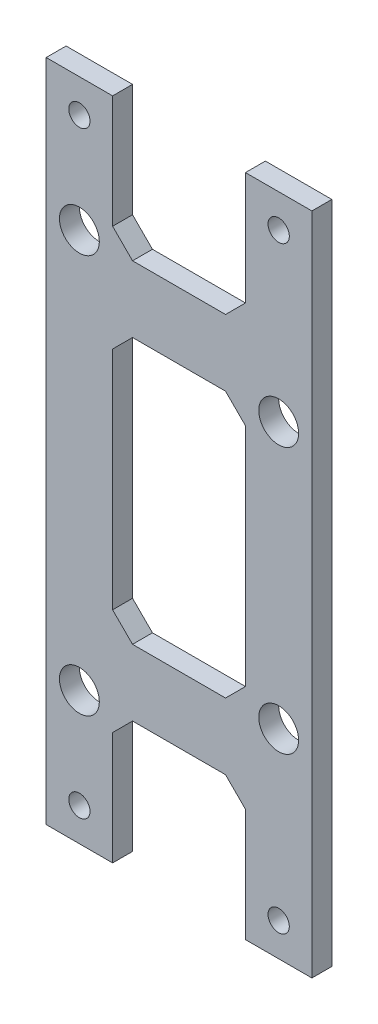
ISO-10303-21;
HEADER;
FILE_DESCRIPTION(('STEP AP214'),'2;1');
FILE_NAME('part.step','',(''),(''),'','','');
FILE_SCHEMA(('AUTOMOTIVE_DESIGN { 1 0 10303 214 1 1 1 1 }'));
ENDSEC;
DATA;
#1=APPLICATION_CONTEXT('core data for automotive mechanical design processes');
#2=APPLICATION_PROTOCOL_DEFINITION('international standard','automotive_design',2000,#1);
#3=PRODUCT_CONTEXT('',#1,'mechanical');
#4=PRODUCT('Part','Part','',(#3));
#5=PRODUCT_RELATED_PRODUCT_CATEGORY('part','',(#4));
#6=PRODUCT_DEFINITION_FORMATION('','',#4);
#7=PRODUCT_DEFINITION_CONTEXT('part definition',#1,'design');
#8=PRODUCT_DEFINITION('design','',#6,#7);
#9=PRODUCT_DEFINITION_SHAPE('','',#8);
#10=(LENGTH_UNIT() NAMED_UNIT(*) SI_UNIT(.MILLI.,.METRE.));
#11=(NAMED_UNIT(*) PLANE_ANGLE_UNIT() SI_UNIT($,.RADIAN.));
#12=(NAMED_UNIT(*) SI_UNIT($,.STERADIAN.) SOLID_ANGLE_UNIT());
#13=UNCERTAINTY_MEASURE_WITH_UNIT(LENGTH_MEASURE(1.E-05),#10,'distance_accuracy_value','');
#14=(GEOMETRIC_REPRESENTATION_CONTEXT(3) GLOBAL_UNCERTAINTY_ASSIGNED_CONTEXT((#13)) GLOBAL_UNIT_ASSIGNED_CONTEXT((#10,
#11,#12)) REPRESENTATION_CONTEXT('',''));
#15=CARTESIAN_POINT('',(0.,0.,0.));
#16=DIRECTION('',(0.,0.,1.));
#17=DIRECTION('',(1.,0.,0.));
#18=AXIS2_PLACEMENT_3D('',#15,#16,#17);
#19=CARTESIAN_POINT('',(0.,0.,3.));
#20=DIRECTION('',(0.,1.,0.));
#21=DIRECTION('',(0.,0.,1.));
#22=AXIS2_PLACEMENT_3D('',#19,#20,#21);
#23=PLANE('',#22);
#24=DIRECTION('',(1.,0.,0.));
#25=VECTOR('',#24,1.);
#26=CARTESIAN_POINT('',(0.,0.,0.));
#27=LINE('',#26,#25);
#28=CARTESIAN_POINT('',(0.,0.,0.));
#29=VERTEX_POINT('',#28);
#30=CARTESIAN_POINT('',(10.,0.,0.));
#31=VERTEX_POINT('',#30);
#32=EDGE_CURVE('E380',#29,#31,#27,.T.);
#33=ORIENTED_EDGE('',*,*,#32,.T.);
#34=DIRECTION('',(0.,0.,1.));
#35=VECTOR('',#34,1.);
#36=CARTESIAN_POINT('',(10.,0.,0.));
#37=LINE('',#36,#35);
#38=CARTESIAN_POINT('',(10.,0.,3.));
#39=VERTEX_POINT('',#38);
#40=EDGE_CURVE('E410',#31,#39,#37,.T.);
#41=ORIENTED_EDGE('',*,*,#40,.T.);
#42=DIRECTION('',(1.,0.,0.));
#43=VECTOR('',#42,1.);
#44=CARTESIAN_POINT('',(0.,0.,3.));
#45=LINE('',#44,#43);
#46=CARTESIAN_POINT('',(0.,0.,3.));
#47=VERTEX_POINT('',#46);
#48=EDGE_CURVE('E367',#47,#39,#45,.T.);
#49=ORIENTED_EDGE('',*,*,#48,.F.);
#50=DIRECTION('',(0.,0.,-1.));
#51=VECTOR('',#50,1.);
#52=CARTESIAN_POINT('',(0.,0.,3.));
#53=LINE('',#52,#51);
#54=EDGE_CURVE('E237',#47,#29,#53,.T.);
#55=ORIENTED_EDGE('',*,*,#54,.T.);
#56=EDGE_LOOP('',(#33,#41,#49,#55));
#57=FACE_BOUND('',#56,.T.);
#58=ADVANCED_FACE('F35',(#57),#23,.F.);
#59=CARTESIAN_POINT('',(0.,100.,3.));
#60=DIRECTION('',(0.,-1.,0.));
#61=DIRECTION('',(1.,0.,0.));
#62=AXIS2_PLACEMENT_3D('',#59,#60,#61);
#63=PLANE('',#62);
#64=DIRECTION('',(-1.,0.,0.));
#65=VECTOR('',#64,1.);
#66=CARTESIAN_POINT('',(0.,100.,3.));
#67=LINE('',#66,#65);
#68=CARTESIAN_POINT('',(10.,100.,3.));
#69=VERTEX_POINT('',#68);
#70=CARTESIAN_POINT('',(0.,100.,3.));
#71=VERTEX_POINT('',#70);
#72=EDGE_CURVE('E374',#69,#71,#67,.T.);
#73=ORIENTED_EDGE('',*,*,#72,.F.);
#74=DIRECTION('',(0.,0.,1.));
#75=VECTOR('',#74,1.);
#76=CARTESIAN_POINT('',(10.,100.,0.));
#77=LINE('',#76,#75);
#78=CARTESIAN_POINT('',(10.,100.,0.));
#79=VERTEX_POINT('',#78);
#80=EDGE_CURVE('E213',#79,#69,#77,.T.);
#81=ORIENTED_EDGE('',*,*,#80,.F.);
#82=DIRECTION('',(-1.,0.,0.));
#83=VECTOR('',#82,1.);
#84=CARTESIAN_POINT('',(0.,100.,0.));
#85=LINE('',#84,#83);
#86=CARTESIAN_POINT('',(0.,100.,0.));
#87=VERTEX_POINT('',#86);
#88=EDGE_CURVE('E220',#79,#87,#85,.T.);
#89=ORIENTED_EDGE('',*,*,#88,.T.);
#90=DIRECTION('',(0.,0.,-1.));
#91=VECTOR('',#90,1.);
#92=CARTESIAN_POINT('',(0.,100.,3.));
#93=LINE('',#92,#91);
#94=EDGE_CURVE('E229',#71,#87,#93,.T.);
#95=ORIENTED_EDGE('',*,*,#94,.F.);
#96=EDGE_LOOP('',(#73,#81,#89,#95));
#97=FACE_BOUND('',#96,.T.);
#98=ADVANCED_FACE('F338',(#97),#63,.F.);
#99=CARTESIAN_POINT('',(0.,0.,3.));
#100=DIRECTION('',(0.,0.,-1.));
#101=DIRECTION('',(-1.,0.,0.));
#102=AXIS2_PLACEMENT_3D('',#99,#100,#101);
#103=PLANE('',#102);
#104=DIRECTION('',(-1.,0.,0.));
#105=VECTOR('',#104,1.);
#106=CARTESIAN_POINT('',(30.,70.,3.));
#107=LINE('',#106,#105);
#108=CARTESIAN_POINT('',(27.,70.,3.));
#109=VERTEX_POINT('',#108);
#110=CARTESIAN_POINT('',(13.,70.,3.));
#111=VERTEX_POINT('',#110);
#112=EDGE_CURVE('E497',#109,#111,#107,.T.);
#113=ORIENTED_EDGE('',*,*,#112,.F.);
#114=DIRECTION('',(-0.707106781186551,0.707106781186544,0.));
#115=VECTOR('',#114,1.);
#116=CARTESIAN_POINT('',(48.4999999999999,48.5000000000003,3.));
#117=LINE('',#116,#115);
#118=CARTESIAN_POINT('',(30.,67.,3.));
#119=VERTEX_POINT('',#118);
#120=EDGE_CURVE('E291',#109,#119,#117,.F.);
#121=ORIENTED_EDGE('',*,*,#120,.T.);
#122=DIRECTION('',(0.,1.,0.));
#123=VECTOR('',#122,1.);
#124=CARTESIAN_POINT('',(30.,30.,3.));
#125=LINE('',#124,#123);
#126=CARTESIAN_POINT('',(30.,33.,3.));
#127=VERTEX_POINT('',#126);
#128=EDGE_CURVE('E503',#127,#119,#125,.T.);
#129=ORIENTED_EDGE('',*,*,#128,.F.);
#130=DIRECTION('',(0.707106781186544,0.707106781186551,0.));
#131=VECTOR('',#130,1.);
#132=CARTESIAN_POINT('',(-1.49999999999988,1.49999999999986,3.));
#133=LINE('',#132,#131);
#134=CARTESIAN_POINT('',(27.,30.,3.));
#135=VERTEX_POINT('',#134);
#136=EDGE_CURVE('E303',#127,#135,#133,.F.);
#137=ORIENTED_EDGE('',*,*,#136,.T.);
#138=DIRECTION('',(1.,0.,0.));
#139=VECTOR('',#138,1.);
#140=CARTESIAN_POINT('',(30.,30.,3.));
#141=LINE('',#140,#139);
#142=CARTESIAN_POINT('',(13.,30.,3.));
#143=VERTEX_POINT('',#142);
#144=EDGE_CURVE('E506',#143,#135,#141,.T.);
#145=ORIENTED_EDGE('',*,*,#144,.F.);
#146=DIRECTION('',(0.70710678118655,-0.707106781186545,0.));
#147=VECTOR('',#146,1.);
#148=CARTESIAN_POINT('',(21.5,21.5000000000001,3.));
#149=LINE('',#148,#147);
#150=CARTESIAN_POINT('',(10.,33.,3.));
#151=VERTEX_POINT('',#150);
#152=EDGE_CURVE('E299',#143,#151,#149,.F.);
#153=ORIENTED_EDGE('',*,*,#152,.T.);
#154=DIRECTION('',(0.,-1.,0.));
#155=VECTOR('',#154,1.);
#156=CARTESIAN_POINT('',(10.,30.,3.));
#157=LINE('',#156,#155);
#158=CARTESIAN_POINT('',(10.,67.,3.));
#159=VERTEX_POINT('',#158);
#160=EDGE_CURVE('E502',#159,#151,#157,.T.);
#161=ORIENTED_EDGE('',*,*,#160,.F.);
#162=DIRECTION('',(-0.707106781186543,-0.707106781186552,0.));
#163=VECTOR('',#162,1.);
#164=CARTESIAN_POINT('',(-28.4999999999999,28.4999999999995,3.));
#165=LINE('',#164,#163);
#166=EDGE_CURVE('E295',#159,#111,#165,.F.);
#167=ORIENTED_EDGE('',*,*,#166,.T.);
#168=EDGE_LOOP('',(#113,#121,#129,#137,#145,#153,#161,#167));
#169=FACE_BOUND('',#168,.T.);
#170=DIRECTION('',(1.,0.,0.));
#171=VECTOR('',#170,1.);
#172=CARTESIAN_POINT('',(10.,80.,3.));
#173=LINE('',#172,#171);
#174=CARTESIAN_POINT('',(13.,80.,3.));
#175=VERTEX_POINT('',#174);
#176=CARTESIAN_POINT('',(27.,80.,3.));
#177=VERTEX_POINT('',#176);
#178=EDGE_CURVE('E323',#175,#177,#173,.T.);
#179=ORIENTED_EDGE('',*,*,#178,.F.);
#180=DIRECTION('',(0.707106781186551,-0.707106781186544,0.));
#181=VECTOR('',#180,1.);
#182=CARTESIAN_POINT('',(46.5,46.5000000000004,3.));
#183=LINE('',#182,#181);
#184=CARTESIAN_POINT('',(10.,83.,3.));
#185=VERTEX_POINT('',#184);
#186=EDGE_CURVE('E315',#175,#185,#183,.F.);
#187=ORIENTED_EDGE('',*,*,#186,.T.);
#188=DIRECTION('',(0.,-1.,0.));
#189=VECTOR('',#188,1.);
#190=CARTESIAN_POINT('',(10.,100.,3.));
#191=LINE('',#190,#189);
#192=EDGE_CURVE('E328',#69,#185,#191,.T.);
#193=ORIENTED_EDGE('',*,*,#192,.F.);
#194=ORIENTED_EDGE('',*,*,#72,.T.);
#195=DIRECTION('',(0.,-1.,0.));
#196=VECTOR('',#195,1.);
#197=CARTESIAN_POINT('',(0.,0.,3.));
#198=LINE('',#197,#196);
#199=EDGE_CURVE('E219',#71,#47,#198,.T.);
#200=ORIENTED_EDGE('',*,*,#199,.T.);
#201=ORIENTED_EDGE('',*,*,#48,.T.);
#202=DIRECTION('',(0.,-1.,0.));
#203=VECTOR('',#202,1.);
#204=CARTESIAN_POINT('',(10.,20.,3.));
#205=LINE('',#204,#203);
#206=CARTESIAN_POINT('',(10.,17.,3.));
#207=VERTEX_POINT('',#206);
#208=EDGE_CURVE('E405',#207,#39,#205,.T.);
#209=ORIENTED_EDGE('',*,*,#208,.F.);
#210=DIRECTION('',(-0.707106781186544,-0.707106781186551,0.));
#211=VECTOR('',#210,1.);
#212=CARTESIAN_POINT('',(-3.49999999999994,3.49999999999991,3.));
#213=LINE('',#212,#211);
#214=CARTESIAN_POINT('',(13.,20.,3.));
#215=VERTEX_POINT('',#214);
#216=EDGE_CURVE('E307',#207,#215,#213,.F.);
#217=ORIENTED_EDGE('',*,*,#216,.T.);
#218=DIRECTION('',(-1.,0.,0.));
#219=VECTOR('',#218,1.);
#220=CARTESIAN_POINT('',(10.,20.,3.));
#221=LINE('',#220,#219);
#222=CARTESIAN_POINT('',(27.,20.,3.));
#223=VERTEX_POINT('',#222);
#224=EDGE_CURVE('E398',#223,#215,#221,.T.);
#225=ORIENTED_EDGE('',*,*,#224,.F.);
#226=DIRECTION('',(-0.70710678118655,0.707106781186545,0.));
#227=VECTOR('',#226,1.);
#228=CARTESIAN_POINT('',(23.4999999999999,23.5000000000001,3.));
#229=LINE('',#228,#227);
#230=CARTESIAN_POINT('',(30.,17.,3.));
#231=VERTEX_POINT('',#230);
#232=EDGE_CURVE('E311',#223,#231,#229,.F.);
#233=ORIENTED_EDGE('',*,*,#232,.T.);
#234=DIRECTION('',(0.,1.,0.));
#235=VECTOR('',#234,1.);
#236=CARTESIAN_POINT('',(30.,20.,3.));
#237=LINE('',#236,#235);
#238=CARTESIAN_POINT('',(30.,0.,3.));
#239=VERTEX_POINT('',#238);
#240=EDGE_CURVE('E402',#239,#231,#237,.T.);
#241=ORIENTED_EDGE('',*,*,#240,.F.);
#242=CARTESIAN_POINT('',(40.,0.,3.));
#243=VERTEX_POINT('',#242);
#244=EDGE_CURVE('E223',#239,#243,#45,.T.);
#245=ORIENTED_EDGE('',*,*,#244,.T.);
#246=DIRECTION('',(0.,1.,0.));
#247=VECTOR('',#246,1.);
#248=CARTESIAN_POINT('',(40.,0.,3.));
#249=LINE('',#248,#247);
#250=CARTESIAN_POINT('',(40.,100.,3.));
#251=VERTEX_POINT('',#250);
#252=EDGE_CURVE('E370',#243,#251,#249,.T.);
#253=ORIENTED_EDGE('',*,*,#252,.T.);
#254=CARTESIAN_POINT('',(30.,100.,3.));
#255=VERTEX_POINT('',#254);
#256=EDGE_CURVE('E232',#251,#255,#67,.T.);
#257=ORIENTED_EDGE('',*,*,#256,.T.);
#258=DIRECTION('',(0.,1.,0.));
#259=VECTOR('',#258,1.);
#260=CARTESIAN_POINT('',(30.,100.,3.));
#261=LINE('',#260,#259);
#262=CARTESIAN_POINT('',(30.,83.,3.));
#263=VERTEX_POINT('',#262);
#264=EDGE_CURVE('E209',#263,#255,#261,.T.);
#265=ORIENTED_EDGE('',*,*,#264,.F.);
#266=DIRECTION('',(0.707106781186543,0.707106781186552,0.));
#267=VECTOR('',#266,1.);
#268=CARTESIAN_POINT('',(-26.4999999999998,26.4999999999994,3.));
#269=LINE('',#268,#267);
#270=EDGE_CURVE('E44',#263,#177,#269,.F.);
#271=ORIENTED_EDGE('',*,*,#270,.T.);
#272=EDGE_LOOP('',(#179,#187,#193,#194,#200,#201,#209,#217,#225,#233,#241,#245,#253,#257,#265,#271));
#273=FACE_BOUND('',#272,.T.);
#274=CARTESIAN_POINT('',(5.,95.,3.));
#275=DIRECTION('',(0.,0.,1.));
#276=DIRECTION('',(1.,0.,0.));
#277=AXIS2_PLACEMENT_3D('',#274,#275,#276);
#278=CIRCLE('',#277,1.60000000000002);
#279=CARTESIAN_POINT('',(6.60000000000002,95.,3.));
#280=VERTEX_POINT('',#279);
#281=EDGE_CURVE('E379',#280,#280,#278,.T.);
#282=ORIENTED_EDGE('',*,*,#281,.F.);
#283=EDGE_LOOP('',(#282));
#284=FACE_BOUND('',#283,.T.);
#285=CARTESIAN_POINT('',(35.,95.,3.));
#286=DIRECTION('',(0.,0.,1.));
#287=DIRECTION('',(1.,0.,0.));
#288=AXIS2_PLACEMENT_3D('',#285,#286,#287);
#289=CIRCLE('',#288,1.60000000000001);
#290=CARTESIAN_POINT('',(36.6,95.,3.));
#291=VERTEX_POINT('',#290);
#292=EDGE_CURVE('E449',#291,#291,#289,.T.);
#293=ORIENTED_EDGE('',*,*,#292,.F.);
#294=EDGE_LOOP('',(#293));
#295=FACE_BOUND('',#294,.T.);
#296=CARTESIAN_POINT('',(5.,80.,3.));
#297=DIRECTION('',(0.,0.,1.));
#298=DIRECTION('',(1.,0.,0.));
#299=AXIS2_PLACEMENT_3D('',#296,#297,#298);
#300=CIRCLE('',#299,3.);
#301=CARTESIAN_POINT('',(8.,80.,3.));
#302=VERTEX_POINT('',#301);
#303=EDGE_CURVE('E443',#302,#302,#300,.T.);
#304=ORIENTED_EDGE('',*,*,#303,.F.);
#305=EDGE_LOOP('',(#304));
#306=FACE_BOUND('',#305,.T.);
#307=CARTESIAN_POINT('',(35.,70.,3.));
#308=DIRECTION('',(0.,0.,1.));
#309=DIRECTION('',(1.,0.,0.));
#310=AXIS2_PLACEMENT_3D('',#307,#308,#309);
#311=CIRCLE('',#310,3.);
#312=CARTESIAN_POINT('',(38.,70.,3.));
#313=VERTEX_POINT('',#312);
#314=EDGE_CURVE('E437',#313,#313,#311,.T.);
#315=ORIENTED_EDGE('',*,*,#314,.F.);
#316=EDGE_LOOP('',(#315));
#317=FACE_BOUND('',#316,.T.);
#318=CARTESIAN_POINT('',(5.,20.,3.));
#319=DIRECTION('',(0.,0.,1.));
#320=DIRECTION('',(1.,0.,0.));
#321=AXIS2_PLACEMENT_3D('',#318,#319,#320);
#322=CIRCLE('',#321,3.);
#323=CARTESIAN_POINT('',(8.,20.,3.));
#324=VERTEX_POINT('',#323);
#325=EDGE_CURVE('E431',#324,#324,#322,.T.);
#326=ORIENTED_EDGE('',*,*,#325,.F.);
#327=EDGE_LOOP('',(#326));
#328=FACE_BOUND('',#327,.T.);
#329=CARTESIAN_POINT('',(35.,30.,3.));
#330=DIRECTION('',(0.,0.,1.));
#331=DIRECTION('',(1.,0.,0.));
#332=AXIS2_PLACEMENT_3D('',#329,#330,#331);
#333=CIRCLE('',#332,3.);
#334=CARTESIAN_POINT('',(38.,30.,3.));
#335=VERTEX_POINT('',#334);
#336=EDGE_CURVE('E425',#335,#335,#333,.T.);
#337=ORIENTED_EDGE('',*,*,#336,.F.);
#338=EDGE_LOOP('',(#337));
#339=FACE_BOUND('',#338,.T.);
#340=CARTESIAN_POINT('',(5.,5.,3.));
#341=DIRECTION('',(0.,0.,1.));
#342=DIRECTION('',(1.,0.,0.));
#343=AXIS2_PLACEMENT_3D('',#340,#341,#342);
#344=CIRCLE('',#343,1.6);
#345=CARTESIAN_POINT('',(6.6,5.,3.));
#346=VERTEX_POINT('',#345);
#347=EDGE_CURVE('E419',#346,#346,#344,.T.);
#348=ORIENTED_EDGE('',*,*,#347,.F.);
#349=EDGE_LOOP('',(#348));
#350=FACE_BOUND('',#349,.T.);
#351=CARTESIAN_POINT('',(35.,5.,3.));
#352=DIRECTION('',(0.,0.,1.));
#353=DIRECTION('',(1.,0.,0.));
#354=AXIS2_PLACEMENT_3D('',#351,#352,#353);
#355=CIRCLE('',#354,1.6);
#356=CARTESIAN_POINT('',(36.6,5.,3.));
#357=VERTEX_POINT('',#356);
#358=EDGE_CURVE('E412',#357,#357,#355,.T.);
#359=ORIENTED_EDGE('',*,*,#358,.F.);
#360=EDGE_LOOP('',(#359));
#361=FACE_BOUND('',#360,.T.);
#362=ADVANCED_FACE('F321',(#169,#273,#284,#295,#306,#317,#328,#339,#350,#361),#103,.F.);
#363=CARTESIAN_POINT('',(0.,0.,0.));
#364=DIRECTION('',(0.,0.,-1.));
#365=DIRECTION('',(-1.,0.,0.));
#366=AXIS2_PLACEMENT_3D('',#363,#364,#365);
#367=PLANE('',#366);
#368=DIRECTION('',(0.,-1.,0.));
#369=VECTOR('',#368,1.);
#370=CARTESIAN_POINT('',(30.,0.,0.));
#371=LINE('',#370,#369);
#372=CARTESIAN_POINT('',(30.,67.,0.));
#373=VERTEX_POINT('',#372);
#374=CARTESIAN_POINT('',(30.,33.,0.));
#375=VERTEX_POINT('',#374);
#376=EDGE_CURVE('E249',#373,#375,#371,.T.);
#377=ORIENTED_EDGE('',*,*,#376,.F.);
#378=DIRECTION('',(0.707106781186551,-0.707106781186544,0.));
#379=VECTOR('',#378,1.);
#380=CARTESIAN_POINT('',(27.,70.,0.));
#381=LINE('',#380,#379);
#382=CARTESIAN_POINT('',(27.,70.,0.));
#383=VERTEX_POINT('',#382);
#384=EDGE_CURVE('E293',#373,#383,#381,.F.);
#385=ORIENTED_EDGE('',*,*,#384,.T.);
#386=DIRECTION('',(1.,0.,0.));
#387=VECTOR('',#386,1.);
#388=CARTESIAN_POINT('',(0.,70.,0.));
#389=LINE('',#388,#387);
#390=CARTESIAN_POINT('',(13.,70.,0.));
#391=VERTEX_POINT('',#390);
#392=EDGE_CURVE('E240',#391,#383,#389,.T.);
#393=ORIENTED_EDGE('',*,*,#392,.F.);
#394=DIRECTION('',(0.707106781186543,0.707106781186552,0.));
#395=VECTOR('',#394,1.);
#396=CARTESIAN_POINT('',(10.,67.,0.));
#397=LINE('',#396,#395);
#398=CARTESIAN_POINT('',(10.,67.,0.));
#399=VERTEX_POINT('',#398);
#400=EDGE_CURVE('E297',#391,#399,#397,.F.);
#401=ORIENTED_EDGE('',*,*,#400,.T.);
#402=DIRECTION('',(0.,1.,0.));
#403=VECTOR('',#402,1.);
#404=CARTESIAN_POINT('',(10.,0.,0.));
#405=LINE('',#404,#403);
#406=CARTESIAN_POINT('',(10.,33.,0.));
#407=VERTEX_POINT('',#406);
#408=EDGE_CURVE('E243',#407,#399,#405,.T.);
#409=ORIENTED_EDGE('',*,*,#408,.F.);
#410=DIRECTION('',(-0.70710678118655,0.707106781186545,0.));
#411=VECTOR('',#410,1.);
#412=CARTESIAN_POINT('',(13.,30.,0.));
#413=LINE('',#412,#411);
#414=CARTESIAN_POINT('',(13.,30.,0.));
#415=VERTEX_POINT('',#414);
#416=EDGE_CURVE('E301',#407,#415,#413,.F.);
#417=ORIENTED_EDGE('',*,*,#416,.T.);
#418=DIRECTION('',(-1.,0.,0.));
#419=VECTOR('',#418,1.);
#420=CARTESIAN_POINT('',(0.,30.,0.));
#421=LINE('',#420,#419);
#422=CARTESIAN_POINT('',(27.,30.,0.));
#423=VERTEX_POINT('',#422);
#424=EDGE_CURVE('E246',#423,#415,#421,.T.);
#425=ORIENTED_EDGE('',*,*,#424,.F.);
#426=DIRECTION('',(-0.707106781186544,-0.707106781186551,0.));
#427=VECTOR('',#426,1.);
#428=CARTESIAN_POINT('',(30.,33.,0.));
#429=LINE('',#428,#427);
#430=EDGE_CURVE('E305',#423,#375,#429,.F.);
#431=ORIENTED_EDGE('',*,*,#430,.T.);
#432=EDGE_LOOP('',(#377,#385,#393,#401,#409,#417,#425,#431));
#433=FACE_BOUND('',#432,.T.);
#434=DIRECTION('',(0.,-1.,0.));
#435=VECTOR('',#434,1.);
#436=CARTESIAN_POINT('',(10.,100.,0.));
#437=LINE('',#436,#435);
#438=CARTESIAN_POINT('',(10.,83.,0.));
#439=VERTEX_POINT('',#438);
#440=EDGE_CURVE('E512',#79,#439,#437,.T.);
#441=ORIENTED_EDGE('',*,*,#440,.T.);
#442=DIRECTION('',(-0.707106781186551,0.707106781186544,0.));
#443=VECTOR('',#442,1.);
#444=CARTESIAN_POINT('',(13.,80.,0.));
#445=LINE('',#444,#443);
#446=CARTESIAN_POINT('',(13.,80.,0.));
#447=VERTEX_POINT('',#446);
#448=EDGE_CURVE('E317',#439,#447,#445,.F.);
#449=ORIENTED_EDGE('',*,*,#448,.T.);
#450=DIRECTION('',(1.,0.,0.));
#451=VECTOR('',#450,1.);
#452=CARTESIAN_POINT('',(10.,80.,0.));
#453=LINE('',#452,#451);
#454=CARTESIAN_POINT('',(27.,80.,0.));
#455=VERTEX_POINT('',#454);
#456=EDGE_CURVE('E204',#447,#455,#453,.T.);
#457=ORIENTED_EDGE('',*,*,#456,.T.);
#458=DIRECTION('',(-0.707106781186543,-0.707106781186552,0.));
#459=VECTOR('',#458,1.);
#460=CARTESIAN_POINT('',(30.,83.,0.));
#461=LINE('',#460,#459);
#462=CARTESIAN_POINT('',(30.,83.,0.));
#463=VERTEX_POINT('',#462);
#464=EDGE_CURVE('E11',#455,#463,#461,.F.);
#465=ORIENTED_EDGE('',*,*,#464,.T.);
#466=DIRECTION('',(0.,1.,0.));
#467=VECTOR('',#466,1.);
#468=CARTESIAN_POINT('',(30.,100.,0.));
#469=LINE('',#468,#467);
#470=CARTESIAN_POINT('',(30.,100.,0.));
#471=VERTEX_POINT('',#470);
#472=EDGE_CURVE('E194',#463,#471,#469,.T.);
#473=ORIENTED_EDGE('',*,*,#472,.T.);
#474=CARTESIAN_POINT('',(40.,100.,0.));
#475=VERTEX_POINT('',#474);
#476=EDGE_CURVE('E201',#475,#471,#85,.T.);
#477=ORIENTED_EDGE('',*,*,#476,.F.);
#478=DIRECTION('',(0.,1.,0.));
#479=VECTOR('',#478,1.);
#480=CARTESIAN_POINT('',(40.,0.,0.));
#481=LINE('',#480,#479);
#482=CARTESIAN_POINT('',(40.,0.,0.));
#483=VERTEX_POINT('',#482);
#484=EDGE_CURVE('E225',#483,#475,#481,.T.);
#485=ORIENTED_EDGE('',*,*,#484,.F.);
#486=CARTESIAN_POINT('',(30.,0.,0.));
#487=VERTEX_POINT('',#486);
#488=EDGE_CURVE('E378',#487,#483,#27,.T.);
#489=ORIENTED_EDGE('',*,*,#488,.F.);
#490=DIRECTION('',(0.,1.,0.));
#491=VECTOR('',#490,1.);
#492=CARTESIAN_POINT('',(30.,20.,0.));
#493=LINE('',#492,#491);
#494=CARTESIAN_POINT('',(30.,17.,0.));
#495=VERTEX_POINT('',#494);
#496=EDGE_CURVE('E383',#487,#495,#493,.T.);
#497=ORIENTED_EDGE('',*,*,#496,.T.);
#498=DIRECTION('',(0.70710678118655,-0.707106781186545,0.));
#499=VECTOR('',#498,1.);
#500=CARTESIAN_POINT('',(27.,20.,0.));
#501=LINE('',#500,#499);
#502=CARTESIAN_POINT('',(27.,20.,0.));
#503=VERTEX_POINT('',#502);
#504=EDGE_CURVE('E313',#495,#503,#501,.F.);
#505=ORIENTED_EDGE('',*,*,#504,.T.);
#506=DIRECTION('',(-1.,0.,0.));
#507=VECTOR('',#506,1.);
#508=CARTESIAN_POINT('',(10.,20.,0.));
#509=LINE('',#508,#507);
#510=CARTESIAN_POINT('',(13.,20.,0.));
#511=VERTEX_POINT('',#510);
#512=EDGE_CURVE('E388',#503,#511,#509,.T.);
#513=ORIENTED_EDGE('',*,*,#512,.T.);
#514=DIRECTION('',(0.707106781186544,0.707106781186551,0.));
#515=VECTOR('',#514,1.);
#516=CARTESIAN_POINT('',(10.,17.,0.));
#517=LINE('',#516,#515);
#518=CARTESIAN_POINT('',(10.,17.,0.));
#519=VERTEX_POINT('',#518);
#520=EDGE_CURVE('E309',#511,#519,#517,.F.);
#521=ORIENTED_EDGE('',*,*,#520,.T.);
#522=DIRECTION('',(0.,-1.,0.));
#523=VECTOR('',#522,1.);
#524=CARTESIAN_POINT('',(10.,20.,0.));
#525=LINE('',#524,#523);
#526=EDGE_CURVE('E389',#519,#31,#525,.T.);
#527=ORIENTED_EDGE('',*,*,#526,.T.);
#528=ORIENTED_EDGE('',*,*,#32,.F.);
#529=DIRECTION('',(0.,-1.,0.));
#530=VECTOR('',#529,1.);
#531=CARTESIAN_POINT('',(0.,0.,0.));
#532=LINE('',#531,#530);
#533=EDGE_CURVE('E376',#87,#29,#532,.T.);
#534=ORIENTED_EDGE('',*,*,#533,.F.);
#535=ORIENTED_EDGE('',*,*,#88,.F.);
#536=EDGE_LOOP('',(#441,#449,#457,#465,#473,#477,#485,#489,#497,#505,#513,#521,#527,#528,#534,#535));
#537=FACE_BOUND('',#536,.T.);
#538=CARTESIAN_POINT('',(5.,5.,0.));
#539=DIRECTION('',(0.,0.,1.));
#540=DIRECTION('',(1.,0.,0.));
#541=AXIS2_PLACEMENT_3D('',#538,#539,#540);
#542=CIRCLE('',#541,1.6);
#543=CARTESIAN_POINT('',(6.6,5.,0.));
#544=VERTEX_POINT('',#543);
#545=EDGE_CURVE('E415',#544,#544,#542,.T.);
#546=ORIENTED_EDGE('',*,*,#545,.T.);
#547=EDGE_LOOP('',(#546));
#548=FACE_BOUND('',#547,.T.);
#549=CARTESIAN_POINT('',(5.,20.,0.));
#550=DIRECTION('',(0.,0.,1.));
#551=DIRECTION('',(1.,0.,0.));
#552=AXIS2_PLACEMENT_3D('',#549,#550,#551);
#553=CIRCLE('',#552,3.);
#554=CARTESIAN_POINT('',(8.,20.,0.));
#555=VERTEX_POINT('',#554);
#556=EDGE_CURVE('E428',#555,#555,#553,.T.);
#557=ORIENTED_EDGE('',*,*,#556,.T.);
#558=EDGE_LOOP('',(#557));
#559=FACE_BOUND('',#558,.T.);
#560=CARTESIAN_POINT('',(5.,80.,0.));
#561=DIRECTION('',(0.,0.,1.));
#562=DIRECTION('',(1.,0.,0.));
#563=AXIS2_PLACEMENT_3D('',#560,#561,#562);
#564=CIRCLE('',#563,3.);
#565=CARTESIAN_POINT('',(8.,80.,0.));
#566=VERTEX_POINT('',#565);
#567=EDGE_CURVE('E440',#566,#566,#564,.T.);
#568=ORIENTED_EDGE('',*,*,#567,.T.);
#569=EDGE_LOOP('',(#568));
#570=FACE_BOUND('',#569,.T.);
#571=CARTESIAN_POINT('',(5.,95.,0.));
#572=DIRECTION('',(0.,0.,1.));
#573=DIRECTION('',(1.,0.,0.));
#574=AXIS2_PLACEMENT_3D('',#571,#572,#573);
#575=CIRCLE('',#574,1.60000000000002);
#576=CARTESIAN_POINT('',(6.60000000000002,95.,0.));
#577=VERTEX_POINT('',#576);
#578=EDGE_CURVE('E452',#577,#577,#575,.T.);
#579=ORIENTED_EDGE('',*,*,#578,.T.);
#580=EDGE_LOOP('',(#579));
#581=FACE_BOUND('',#580,.T.);
#582=CARTESIAN_POINT('',(35.,95.,0.));
#583=DIRECTION('',(0.,0.,1.));
#584=DIRECTION('',(1.,0.,0.));
#585=AXIS2_PLACEMENT_3D('',#582,#583,#584);
#586=CIRCLE('',#585,1.60000000000001);
#587=CARTESIAN_POINT('',(36.6,95.,0.));
#588=VERTEX_POINT('',#587);
#589=EDGE_CURVE('E446',#588,#588,#586,.T.);
#590=ORIENTED_EDGE('',*,*,#589,.T.);
#591=EDGE_LOOP('',(#590));
#592=FACE_BOUND('',#591,.T.);
#593=CARTESIAN_POINT('',(35.,70.,0.));
#594=DIRECTION('',(0.,0.,1.));
#595=DIRECTION('',(1.,0.,0.));
#596=AXIS2_PLACEMENT_3D('',#593,#594,#595);
#597=CIRCLE('',#596,3.);
#598=CARTESIAN_POINT('',(38.,70.,0.));
#599=VERTEX_POINT('',#598);
#600=EDGE_CURVE('E434',#599,#599,#597,.T.);
#601=ORIENTED_EDGE('',*,*,#600,.T.);
#602=EDGE_LOOP('',(#601));
#603=FACE_BOUND('',#602,.T.);
#604=CARTESIAN_POINT('',(35.,30.,0.));
#605=DIRECTION('',(0.,0.,1.));
#606=DIRECTION('',(1.,0.,0.));
#607=AXIS2_PLACEMENT_3D('',#604,#605,#606);
#608=CIRCLE('',#607,3.);
#609=CARTESIAN_POINT('',(38.,30.,0.));
#610=VERTEX_POINT('',#609);
#611=EDGE_CURVE('E422',#610,#610,#608,.T.);
#612=ORIENTED_EDGE('',*,*,#611,.T.);
#613=EDGE_LOOP('',(#612));
#614=FACE_BOUND('',#613,.T.);
#615=CARTESIAN_POINT('',(35.,5.,0.));
#616=DIRECTION('',(0.,0.,1.));
#617=DIRECTION('',(1.,0.,0.));
#618=AXIS2_PLACEMENT_3D('',#615,#616,#617);
#619=CIRCLE('',#618,1.6);
#620=CARTESIAN_POINT('',(36.6,5.,0.));
#621=VERTEX_POINT('',#620);
#622=EDGE_CURVE('E416',#621,#621,#619,.T.);
#623=ORIENTED_EDGE('',*,*,#622,.T.);
#624=EDGE_LOOP('',(#623));
#625=FACE_BOUND('',#624,.T.);
#626=ADVANCED_FACE('F197',(#433,#537,#548,#559,#570,#581,#592,#603,#614,#625),#367,.T.);
#627=CARTESIAN_POINT('',(0.,0.,3.));
#628=DIRECTION('',(1.,0.,0.));
#629=DIRECTION('',(0.,0.,-1.));
#630=AXIS2_PLACEMENT_3D('',#627,#628,#629);
#631=PLANE('',#630);
#632=ORIENTED_EDGE('',*,*,#533,.T.);
#633=ORIENTED_EDGE('',*,*,#54,.F.);
#634=ORIENTED_EDGE('',*,*,#199,.F.);
#635=ORIENTED_EDGE('',*,*,#94,.T.);
#636=EDGE_LOOP('',(#632,#633,#634,#635));
#637=FACE_BOUND('',#636,.T.);
#638=ADVANCED_FACE('F352',(#637),#631,.F.);
#639=ORIENTED_EDGE('',*,*,#244,.F.);
#640=DIRECTION('',(0.,0.,1.));
#641=VECTOR('',#640,1.);
#642=CARTESIAN_POINT('',(30.,0.,0.));
#643=LINE('',#642,#641);
#644=EDGE_CURVE('E363',#487,#239,#643,.T.);
#645=ORIENTED_EDGE('',*,*,#644,.F.);
#646=ORIENTED_EDGE('',*,*,#488,.T.);
#647=DIRECTION('',(0.,0.,-1.));
#648=VECTOR('',#647,1.);
#649=CARTESIAN_POINT('',(40.,0.,3.));
#650=LINE('',#649,#648);
#651=EDGE_CURVE('E234',#243,#483,#650,.T.);
#652=ORIENTED_EDGE('',*,*,#651,.F.);
#653=EDGE_LOOP('',(#639,#645,#646,#652));
#654=FACE_BOUND('',#653,.T.);
#655=ADVANCED_FACE('F341',(#654),#23,.F.);
#656=CARTESIAN_POINT('',(40.,0.,3.));
#657=DIRECTION('',(-1.,0.,0.));
#658=DIRECTION('',(0.,0.,1.));
#659=AXIS2_PLACEMENT_3D('',#656,#657,#658);
#660=PLANE('',#659);
#661=ORIENTED_EDGE('',*,*,#484,.T.);
#662=DIRECTION('',(0.,0.,-1.));
#663=VECTOR('',#662,1.);
#664=CARTESIAN_POINT('',(40.,100.,3.));
#665=LINE('',#664,#663);
#666=EDGE_CURVE('E218',#251,#475,#665,.T.);
#667=ORIENTED_EDGE('',*,*,#666,.F.);
#668=ORIENTED_EDGE('',*,*,#252,.F.);
#669=ORIENTED_EDGE('',*,*,#651,.T.);
#670=EDGE_LOOP('',(#661,#667,#668,#669));
#671=FACE_BOUND('',#670,.T.);
#672=ADVANCED_FACE('F351',(#671),#660,.F.);
#673=ORIENTED_EDGE('',*,*,#476,.T.);
#674=DIRECTION('',(0.,0.,1.));
#675=VECTOR('',#674,1.);
#676=CARTESIAN_POINT('',(30.,100.,0.));
#677=LINE('',#676,#675);
#678=EDGE_CURVE('E203',#471,#255,#677,.T.);
#679=ORIENTED_EDGE('',*,*,#678,.T.);
#680=ORIENTED_EDGE('',*,*,#256,.F.);
#681=ORIENTED_EDGE('',*,*,#666,.T.);
#682=EDGE_LOOP('',(#673,#679,#680,#681));
#683=FACE_BOUND('',#682,.T.);
#684=ADVANCED_FACE('F216',(#683),#63,.F.);
#685=CARTESIAN_POINT('',(5.,95.,3.));
#686=DIRECTION('',(0.,0.,-1.));
#687=DIRECTION('',(-1.,0.,0.));
#688=AXIS2_PLACEMENT_3D('',#685,#686,#687);
#689=CYLINDRICAL_SURFACE('',#688,1.60000000000002);
#690=ORIENTED_EDGE('',*,*,#281,.T.);
#691=EDGE_LOOP('',(#690));
#692=FACE_BOUND('',#691,.T.);
#693=ORIENTED_EDGE('',*,*,#578,.F.);
#694=EDGE_LOOP('',(#693));
#695=FACE_BOUND('',#694,.T.);
#696=ADVANCED_FACE('F461',(#692,#695),#689,.F.);
#697=CARTESIAN_POINT('',(35.,95.,3.));
#698=DIRECTION('',(0.,0.,-1.));
#699=DIRECTION('',(-1.,0.,0.));
#700=AXIS2_PLACEMENT_3D('',#697,#698,#699);
#701=CYLINDRICAL_SURFACE('',#700,1.60000000000001);
#702=ORIENTED_EDGE('',*,*,#292,.T.);
#703=EDGE_LOOP('',(#702));
#704=FACE_BOUND('',#703,.T.);
#705=ORIENTED_EDGE('',*,*,#589,.F.);
#706=EDGE_LOOP('',(#705));
#707=FACE_BOUND('',#706,.T.);
#708=ADVANCED_FACE('F463',(#704,#707),#701,.F.);
#709=CARTESIAN_POINT('',(5.,80.,3.));
#710=DIRECTION('',(0.,0.,-1.));
#711=DIRECTION('',(-1.,0.,0.));
#712=AXIS2_PLACEMENT_3D('',#709,#710,#711);
#713=CYLINDRICAL_SURFACE('',#712,3.);
#714=ORIENTED_EDGE('',*,*,#303,.T.);
#715=EDGE_LOOP('',(#714));
#716=FACE_BOUND('',#715,.T.);
#717=ORIENTED_EDGE('',*,*,#567,.F.);
#718=EDGE_LOOP('',(#717));
#719=FACE_BOUND('',#718,.T.);
#720=ADVANCED_FACE('F470',(#716,#719),#713,.F.);
#721=CARTESIAN_POINT('',(35.,70.,3.));
#722=DIRECTION('',(0.,0.,-1.));
#723=DIRECTION('',(-1.,0.,0.));
#724=AXIS2_PLACEMENT_3D('',#721,#722,#723);
#725=CYLINDRICAL_SURFACE('',#724,3.);
#726=ORIENTED_EDGE('',*,*,#314,.T.);
#727=EDGE_LOOP('',(#726));
#728=FACE_BOUND('',#727,.T.);
#729=ORIENTED_EDGE('',*,*,#600,.F.);
#730=EDGE_LOOP('',(#729));
#731=FACE_BOUND('',#730,.T.);
#732=ADVANCED_FACE('F623',(#728,#731),#725,.F.);
#733=CARTESIAN_POINT('',(5.,20.,3.));
#734=DIRECTION('',(0.,0.,-1.));
#735=DIRECTION('',(-1.,0.,0.));
#736=AXIS2_PLACEMENT_3D('',#733,#734,#735);
#737=CYLINDRICAL_SURFACE('',#736,3.);
#738=ORIENTED_EDGE('',*,*,#325,.T.);
#739=EDGE_LOOP('',(#738));
#740=FACE_BOUND('',#739,.T.);
#741=ORIENTED_EDGE('',*,*,#556,.F.);
#742=EDGE_LOOP('',(#741));
#743=FACE_BOUND('',#742,.T.);
#744=ADVANCED_FACE('F619',(#740,#743),#737,.F.);
#745=CARTESIAN_POINT('',(35.,30.,3.));
#746=DIRECTION('',(0.,0.,-1.));
#747=DIRECTION('',(-1.,0.,0.));
#748=AXIS2_PLACEMENT_3D('',#745,#746,#747);
#749=CYLINDRICAL_SURFACE('',#748,3.);
#750=ORIENTED_EDGE('',*,*,#336,.T.);
#751=EDGE_LOOP('',(#750));
#752=FACE_BOUND('',#751,.T.);
#753=ORIENTED_EDGE('',*,*,#611,.F.);
#754=EDGE_LOOP('',(#753));
#755=FACE_BOUND('',#754,.T.);
#756=ADVANCED_FACE('F615',(#752,#755),#749,.F.);
#757=CARTESIAN_POINT('',(5.,5.,3.));
#758=DIRECTION('',(0.,0.,-1.));
#759=DIRECTION('',(-1.,0.,0.));
#760=AXIS2_PLACEMENT_3D('',#757,#758,#759);
#761=CYLINDRICAL_SURFACE('',#760,1.6);
#762=ORIENTED_EDGE('',*,*,#347,.T.);
#763=EDGE_LOOP('',(#762));
#764=FACE_BOUND('',#763,.T.);
#765=ORIENTED_EDGE('',*,*,#545,.F.);
#766=EDGE_LOOP('',(#765));
#767=FACE_BOUND('',#766,.T.);
#768=ADVANCED_FACE('F611',(#764,#767),#761,.F.);
#769=CARTESIAN_POINT('',(35.,5.,3.));
#770=DIRECTION('',(0.,0.,-1.));
#771=DIRECTION('',(-1.,0.,0.));
#772=AXIS2_PLACEMENT_3D('',#769,#770,#771);
#773=CYLINDRICAL_SURFACE('',#772,1.6);
#774=ORIENTED_EDGE('',*,*,#358,.T.);
#775=EDGE_LOOP('',(#774));
#776=FACE_BOUND('',#775,.T.);
#777=ORIENTED_EDGE('',*,*,#622,.F.);
#778=EDGE_LOOP('',(#777));
#779=FACE_BOUND('',#778,.T.);
#780=ADVANCED_FACE('F601',(#776,#779),#773,.F.);
#781=CARTESIAN_POINT('',(10.,100.,0.));
#782=DIRECTION('',(-1.,0.,0.));
#783=DIRECTION('',(0.,-1.,0.));
#784=AXIS2_PLACEMENT_3D('',#781,#782,#783);
#785=PLANE('',#784);
#786=ORIENTED_EDGE('',*,*,#192,.T.);
#787=DIRECTION('',(0.,0.,-1.));
#788=VECTOR('',#787,1.);
#789=CARTESIAN_POINT('',(10.,83.,0.));
#790=LINE('',#789,#788);
#791=EDGE_CURVE('E287',#185,#439,#790,.T.);
#792=ORIENTED_EDGE('',*,*,#791,.T.);
#793=ORIENTED_EDGE('',*,*,#440,.F.);
#794=ORIENTED_EDGE('',*,*,#80,.T.);
#795=EDGE_LOOP('',(#786,#792,#793,#794));
#796=FACE_BOUND('',#795,.T.);
#797=ADVANCED_FACE('F596',(#796),#785,.F.);
#798=CARTESIAN_POINT('',(30.,100.,0.));
#799=DIRECTION('',(1.,0.,0.));
#800=DIRECTION('',(0.,1.,0.));
#801=AXIS2_PLACEMENT_3D('',#798,#799,#800);
#802=PLANE('',#801);
#803=ORIENTED_EDGE('',*,*,#472,.F.);
#804=DIRECTION('',(0.,0.,1.));
#805=VECTOR('',#804,1.);
#806=CARTESIAN_POINT('',(30.,83.,3.));
#807=LINE('',#806,#805);
#808=EDGE_CURVE('E289',#463,#263,#807,.T.);
#809=ORIENTED_EDGE('',*,*,#808,.T.);
#810=ORIENTED_EDGE('',*,*,#264,.T.);
#811=ORIENTED_EDGE('',*,*,#678,.F.);
#812=EDGE_LOOP('',(#803,#809,#810,#811));
#813=FACE_BOUND('',#812,.T.);
#814=ADVANCED_FACE('F207',(#813),#802,.F.);
#815=CARTESIAN_POINT('',(10.,80.,0.));
#816=DIRECTION('',(0.,-1.,0.));
#817=DIRECTION('',(0.,0.,-1.));
#818=AXIS2_PLACEMENT_3D('',#815,#816,#817);
#819=PLANE('',#818);
#820=ORIENTED_EDGE('',*,*,#456,.F.);
#821=DIRECTION('',(0.,0.,1.));
#822=VECTOR('',#821,1.);
#823=CARTESIAN_POINT('',(13.,80.,3.));
#824=LINE('',#823,#822);
#825=EDGE_CURVE('E284',#447,#175,#824,.T.);
#826=ORIENTED_EDGE('',*,*,#825,.T.);
#827=ORIENTED_EDGE('',*,*,#178,.T.);
#828=DIRECTION('',(0.,0.,-1.));
#829=VECTOR('',#828,1.);
#830=CARTESIAN_POINT('',(27.,80.,0.));
#831=LINE('',#830,#829);
#832=EDGE_CURVE('E282',#177,#455,#831,.T.);
#833=ORIENTED_EDGE('',*,*,#832,.T.);
#834=EDGE_LOOP('',(#820,#826,#827,#833));
#835=FACE_BOUND('',#834,.T.);
#836=ADVANCED_FACE('F326',(#835),#819,.F.);
#837=CARTESIAN_POINT('',(10.,20.,0.));
#838=DIRECTION('',(-1.,0.,0.));
#839=DIRECTION('',(0.,-1.,0.));
#840=AXIS2_PLACEMENT_3D('',#837,#838,#839);
#841=PLANE('',#840);
#842=ORIENTED_EDGE('',*,*,#526,.F.);
#843=DIRECTION('',(0.,0.,1.));
#844=VECTOR('',#843,1.);
#845=CARTESIAN_POINT('',(10.,17.,3.));
#846=LINE('',#845,#844);
#847=EDGE_CURVE('E272',#519,#207,#846,.T.);
#848=ORIENTED_EDGE('',*,*,#847,.T.);
#849=ORIENTED_EDGE('',*,*,#208,.T.);
#850=ORIENTED_EDGE('',*,*,#40,.F.);
#851=EDGE_LOOP('',(#842,#848,#849,#850));
#852=FACE_BOUND('',#851,.T.);
#853=ADVANCED_FACE('F522',(#852),#841,.F.);
#854=CARTESIAN_POINT('',(10.,20.,0.));
#855=DIRECTION('',(0.,1.,0.));
#856=DIRECTION('',(0.,0.,1.));
#857=AXIS2_PLACEMENT_3D('',#854,#855,#856);
#858=PLANE('',#857);
#859=ORIENTED_EDGE('',*,*,#224,.T.);
#860=DIRECTION('',(0.,0.,-1.));
#861=VECTOR('',#860,1.);
#862=CARTESIAN_POINT('',(13.,20.,0.));
#863=LINE('',#862,#861);
#864=EDGE_CURVE('E278',#215,#511,#863,.T.);
#865=ORIENTED_EDGE('',*,*,#864,.T.);
#866=ORIENTED_EDGE('',*,*,#512,.F.);
#867=DIRECTION('',(0.,0.,1.));
#868=VECTOR('',#867,1.);
#869=CARTESIAN_POINT('',(27.,20.,3.));
#870=LINE('',#869,#868);
#871=EDGE_CURVE('E275',#503,#223,#870,.T.);
#872=ORIENTED_EDGE('',*,*,#871,.T.);
#873=EDGE_LOOP('',(#859,#865,#866,#872));
#874=FACE_BOUND('',#873,.T.);
#875=ADVANCED_FACE('F397',(#874),#858,.F.);
#876=CARTESIAN_POINT('',(30.,20.,0.));
#877=DIRECTION('',(1.,0.,0.));
#878=DIRECTION('',(0.,1.,0.));
#879=AXIS2_PLACEMENT_3D('',#876,#877,#878);
#880=PLANE('',#879);
#881=ORIENTED_EDGE('',*,*,#240,.T.);
#882=DIRECTION('',(0.,0.,-1.));
#883=VECTOR('',#882,1.);
#884=CARTESIAN_POINT('',(30.,17.,0.));
#885=LINE('',#884,#883);
#886=EDGE_CURVE('E280',#231,#495,#885,.T.);
#887=ORIENTED_EDGE('',*,*,#886,.T.);
#888=ORIENTED_EDGE('',*,*,#496,.F.);
#889=ORIENTED_EDGE('',*,*,#644,.T.);
#890=EDGE_LOOP('',(#881,#887,#888,#889));
#891=FACE_BOUND('',#890,.T.);
#892=ADVANCED_FACE('F593',(#891),#880,.F.);
#893=CARTESIAN_POINT('',(30.,30.,-7.));
#894=DIRECTION('',(1.,0.,0.));
#895=DIRECTION('',(0.,0.,-1.));
#896=AXIS2_PLACEMENT_3D('',#893,#894,#895);
#897=PLANE('',#896);
#898=ORIENTED_EDGE('',*,*,#128,.T.);
#899=DIRECTION('',(0.,0.,-1.));
#900=VECTOR('',#899,1.);
#901=CARTESIAN_POINT('',(30.,67.,0.));
#902=LINE('',#901,#900);
#903=EDGE_CURVE('E260',#119,#373,#902,.T.);
#904=ORIENTED_EDGE('',*,*,#903,.T.);
#905=ORIENTED_EDGE('',*,*,#376,.T.);
#906=DIRECTION('',(0.,0.,1.));
#907=VECTOR('',#906,1.);
#908=CARTESIAN_POINT('',(30.,33.,3.));
#909=LINE('',#908,#907);
#910=EDGE_CURVE('E257',#375,#127,#909,.T.);
#911=ORIENTED_EDGE('',*,*,#910,.T.);
#912=EDGE_LOOP('',(#898,#904,#905,#911));
#913=FACE_BOUND('',#912,.T.);
#914=ADVANCED_FACE('F590',(#913),#897,.F.);
#915=CARTESIAN_POINT('',(30.,30.,-7.));
#916=DIRECTION('',(0.,-1.,0.));
#917=DIRECTION('',(1.,0.,0.));
#918=AXIS2_PLACEMENT_3D('',#915,#916,#917);
#919=PLANE('',#918);
#920=ORIENTED_EDGE('',*,*,#424,.T.);
#921=DIRECTION('',(0.,0.,1.));
#922=VECTOR('',#921,1.);
#923=CARTESIAN_POINT('',(13.,30.,3.));
#924=LINE('',#923,#922);
#925=EDGE_CURVE('E269',#415,#143,#924,.T.);
#926=ORIENTED_EDGE('',*,*,#925,.T.);
#927=ORIENTED_EDGE('',*,*,#144,.T.);
#928=DIRECTION('',(0.,0.,-1.));
#929=VECTOR('',#928,1.);
#930=CARTESIAN_POINT('',(27.,30.,0.));
#931=LINE('',#930,#929);
#932=EDGE_CURVE('E267',#135,#423,#931,.T.);
#933=ORIENTED_EDGE('',*,*,#932,.T.);
#934=EDGE_LOOP('',(#920,#926,#927,#933));
#935=FACE_BOUND('',#934,.T.);
#936=ADVANCED_FACE('F585',(#935),#919,.F.);
#937=CARTESIAN_POINT('',(10.,30.,-7.));
#938=DIRECTION('',(-1.,0.,0.));
#939=DIRECTION('',(0.,0.,1.));
#940=AXIS2_PLACEMENT_3D('',#937,#938,#939);
#941=PLANE('',#940);
#942=ORIENTED_EDGE('',*,*,#408,.T.);
#943=DIRECTION('',(0.,0.,1.));
#944=VECTOR('',#943,1.);
#945=CARTESIAN_POINT('',(10.,67.,3.));
#946=LINE('',#945,#944);
#947=EDGE_CURVE('E264',#399,#159,#946,.T.);
#948=ORIENTED_EDGE('',*,*,#947,.T.);
#949=ORIENTED_EDGE('',*,*,#160,.T.);
#950=DIRECTION('',(0.,0.,-1.));
#951=VECTOR('',#950,1.);
#952=CARTESIAN_POINT('',(10.,33.,0.));
#953=LINE('',#952,#951);
#954=EDGE_CURVE('E262',#151,#407,#953,.T.);
#955=ORIENTED_EDGE('',*,*,#954,.T.);
#956=EDGE_LOOP('',(#942,#948,#949,#955));
#957=FACE_BOUND('',#956,.T.);
#958=ADVANCED_FACE('F580',(#957),#941,.F.);
#959=CARTESIAN_POINT('',(30.,70.,-7.));
#960=DIRECTION('',(0.,1.,0.));
#961=DIRECTION('',(0.,0.,1.));
#962=AXIS2_PLACEMENT_3D('',#959,#960,#961);
#963=PLANE('',#962);
#964=ORIENTED_EDGE('',*,*,#392,.T.);
#965=DIRECTION('',(0.,0.,1.));
#966=VECTOR('',#965,1.);
#967=CARTESIAN_POINT('',(27.,70.,3.));
#968=LINE('',#967,#966);
#969=EDGE_CURVE('E254',#383,#109,#968,.T.);
#970=ORIENTED_EDGE('',*,*,#969,.T.);
#971=ORIENTED_EDGE('',*,*,#112,.T.);
#972=DIRECTION('',(0.,0.,-1.));
#973=VECTOR('',#972,1.);
#974=CARTESIAN_POINT('',(13.,70.,0.));
#975=LINE('',#974,#973);
#976=EDGE_CURVE('E252',#111,#391,#975,.T.);
#977=ORIENTED_EDGE('',*,*,#976,.T.);
#978=EDGE_LOOP('',(#964,#970,#971,#977));
#979=FACE_BOUND('',#978,.T.);
#980=ADVANCED_FACE('F496',(#979),#963,.F.);
#981=CARTESIAN_POINT('',(27.,70.,-7.));
#982=DIRECTION('',(-0.707106781186544,-0.707106781186551,0.));
#983=DIRECTION('',(0.,0.,-1.));
#984=AXIS2_PLACEMENT_3D('',#981,#982,#983);
#985=PLANE('',#984);
#986=ORIENTED_EDGE('',*,*,#384,.F.);
#987=ORIENTED_EDGE('',*,*,#903,.F.);
#988=ORIENTED_EDGE('',*,*,#120,.F.);
#989=ORIENTED_EDGE('',*,*,#969,.F.);
#990=EDGE_LOOP('',(#986,#987,#988,#989));
#991=FACE_BOUND('',#990,.T.);
#992=ADVANCED_FACE('F492',(#991),#985,.T.);
#993=CARTESIAN_POINT('',(10.,67.,-7.));
#994=DIRECTION('',(0.707106781186552,-0.707106781186543,0.));
#995=DIRECTION('',(0.,0.,-1.));
#996=AXIS2_PLACEMENT_3D('',#993,#994,#995);
#997=PLANE('',#996);
#998=ORIENTED_EDGE('',*,*,#400,.F.);
#999=ORIENTED_EDGE('',*,*,#976,.F.);
#1000=ORIENTED_EDGE('',*,*,#166,.F.);
#1001=ORIENTED_EDGE('',*,*,#947,.F.);
#1002=EDGE_LOOP('',(#998,#999,#1000,#1001));
#1003=FACE_BOUND('',#1002,.T.);
#1004=ADVANCED_FACE('F566',(#1003),#997,.T.);
#1005=CARTESIAN_POINT('',(13.,30.,-7.));
#1006=DIRECTION('',(0.707106781186545,0.70710678118655,0.));
#1007=DIRECTION('',(0.,0.,-1.));
#1008=AXIS2_PLACEMENT_3D('',#1005,#1006,#1007);
#1009=PLANE('',#1008);
#1010=ORIENTED_EDGE('',*,*,#416,.F.);
#1011=ORIENTED_EDGE('',*,*,#954,.F.);
#1012=ORIENTED_EDGE('',*,*,#152,.F.);
#1013=ORIENTED_EDGE('',*,*,#925,.F.);
#1014=EDGE_LOOP('',(#1010,#1011,#1012,#1013));
#1015=FACE_BOUND('',#1014,.T.);
#1016=ADVANCED_FACE('F542',(#1015),#1009,.T.);
#1017=CARTESIAN_POINT('',(30.,33.,-7.));
#1018=DIRECTION('',(-0.707106781186551,0.707106781186544,0.));
#1019=DIRECTION('',(0.,0.,-1.));
#1020=AXIS2_PLACEMENT_3D('',#1017,#1018,#1019);
#1021=PLANE('',#1020);
#1022=ORIENTED_EDGE('',*,*,#430,.F.);
#1023=ORIENTED_EDGE('',*,*,#932,.F.);
#1024=ORIENTED_EDGE('',*,*,#136,.F.);
#1025=ORIENTED_EDGE('',*,*,#910,.F.);
#1026=EDGE_LOOP('',(#1022,#1023,#1024,#1025));
#1027=FACE_BOUND('',#1026,.T.);
#1028=ADVANCED_FACE('F535',(#1027),#1021,.T.);
#1029=CARTESIAN_POINT('',(10.,17.,0.));
#1030=DIRECTION('',(0.707106781186551,-0.707106781186544,0.));
#1031=DIRECTION('',(0.,0.,-1.));
#1032=AXIS2_PLACEMENT_3D('',#1029,#1030,#1031);
#1033=PLANE('',#1032);
#1034=ORIENTED_EDGE('',*,*,#520,.F.);
#1035=ORIENTED_EDGE('',*,*,#864,.F.);
#1036=ORIENTED_EDGE('',*,*,#216,.F.);
#1037=ORIENTED_EDGE('',*,*,#847,.F.);
#1038=EDGE_LOOP('',(#1034,#1035,#1036,#1037));
#1039=FACE_BOUND('',#1038,.T.);
#1040=ADVANCED_FACE('F533',(#1039),#1033,.T.);
#1041=CARTESIAN_POINT('',(27.,20.,0.));
#1042=DIRECTION('',(-0.707106781186545,-0.70710678118655,0.));
#1043=DIRECTION('',(0.,0.,-1.));
#1044=AXIS2_PLACEMENT_3D('',#1041,#1042,#1043);
#1045=PLANE('',#1044);
#1046=ORIENTED_EDGE('',*,*,#504,.F.);
#1047=ORIENTED_EDGE('',*,*,#886,.F.);
#1048=ORIENTED_EDGE('',*,*,#232,.F.);
#1049=ORIENTED_EDGE('',*,*,#871,.F.);
#1050=EDGE_LOOP('',(#1046,#1047,#1048,#1049));
#1051=FACE_BOUND('',#1050,.T.);
#1052=ADVANCED_FACE('F335',(#1051),#1045,.T.);
#1053=CARTESIAN_POINT('',(13.,80.,0.));
#1054=DIRECTION('',(0.707106781186544,0.707106781186551,0.));
#1055=DIRECTION('',(0.,0.,-1.));
#1056=AXIS2_PLACEMENT_3D('',#1053,#1054,#1055);
#1057=PLANE('',#1056);
#1058=ORIENTED_EDGE('',*,*,#448,.F.);
#1059=ORIENTED_EDGE('',*,*,#791,.F.);
#1060=ORIENTED_EDGE('',*,*,#186,.F.);
#1061=ORIENTED_EDGE('',*,*,#825,.F.);
#1062=EDGE_LOOP('',(#1058,#1059,#1060,#1061));
#1063=FACE_BOUND('',#1062,.T.);
#1064=ADVANCED_FACE('F331',(#1063),#1057,.T.);
#1065=CARTESIAN_POINT('',(30.,83.,0.));
#1066=DIRECTION('',(-0.707106781186552,0.707106781186543,0.));
#1067=DIRECTION('',(0.,0.,-1.));
#1068=AXIS2_PLACEMENT_3D('',#1065,#1066,#1067);
#1069=PLANE('',#1068);
#1070=ORIENTED_EDGE('',*,*,#464,.F.);
#1071=ORIENTED_EDGE('',*,*,#832,.F.);
#1072=ORIENTED_EDGE('',*,*,#270,.F.);
#1073=ORIENTED_EDGE('',*,*,#808,.F.);
#1074=EDGE_LOOP('',(#1070,#1071,#1072,#1073));
#1075=FACE_BOUND('',#1074,.T.);
#1076=ADVANCED_FACE('F38',(#1075),#1069,.T.);
#1077=CLOSED_SHELL('',(#58,#98,#362,#626,#638,#655,#672,#684,#696,#708,#720,#732,#744,#756,#768,
#780,#797,#814,#836,#853,#875,#892,#914,#936,#958,#980,#992,#1004,#1016,#1028,#1040,#1052,#1064,#1076));
#1078=MANIFOLD_SOLID_BREP('B2',#1077);
#1079=ADVANCED_BREP_SHAPE_REPRESENTATION('',(#18,#1078),#14);
#1080=SHAPE_DEFINITION_REPRESENTATION(#9,#1079);
ENDSEC;
END-ISO-10303-21;
